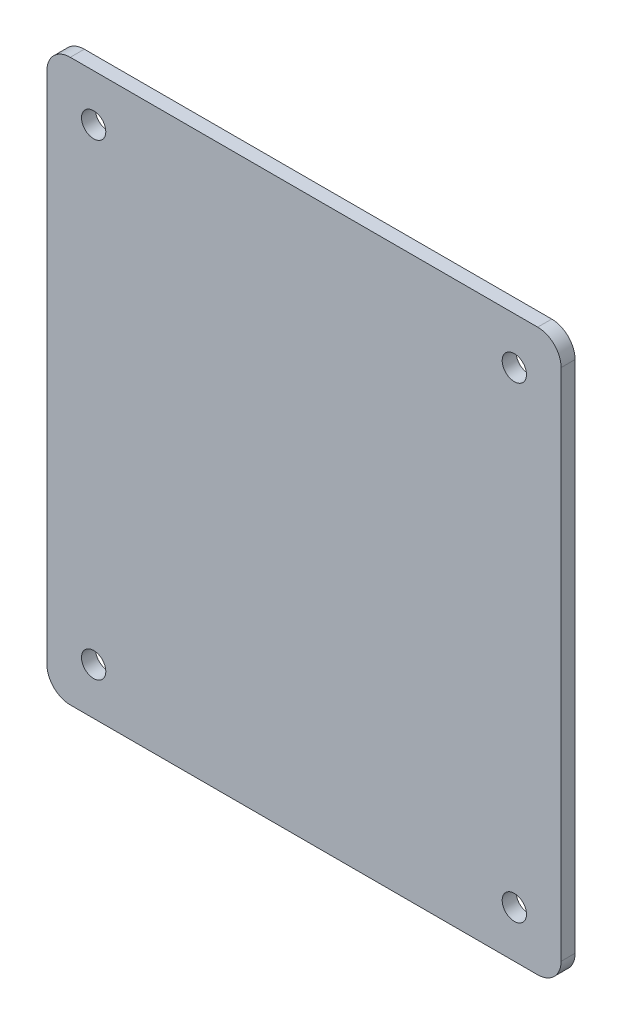
ISO-10303-21;
HEADER;
FILE_DESCRIPTION(('STEP AP214'),'2;1');
FILE_NAME('part.step','',(''),(''),'','','');
FILE_SCHEMA(('AUTOMOTIVE_DESIGN { 1 0 10303 214 1 1 1 1 }'));
ENDSEC;
DATA;
#1=APPLICATION_CONTEXT('core data for automotive mechanical design processes');
#2=APPLICATION_PROTOCOL_DEFINITION('international standard','automotive_design',2000,#1);
#3=PRODUCT_CONTEXT('',#1,'mechanical');
#4=PRODUCT('Part','Part','',(#3));
#5=PRODUCT_RELATED_PRODUCT_CATEGORY('part','',(#4));
#6=PRODUCT_DEFINITION_FORMATION('','',#4);
#7=PRODUCT_DEFINITION_CONTEXT('part definition',#1,'design');
#8=PRODUCT_DEFINITION('design','',#6,#7);
#9=PRODUCT_DEFINITION_SHAPE('','',#8);
#10=(LENGTH_UNIT() NAMED_UNIT(*) SI_UNIT(.MILLI.,.METRE.));
#11=(NAMED_UNIT(*) PLANE_ANGLE_UNIT() SI_UNIT($,.RADIAN.));
#12=(NAMED_UNIT(*) SI_UNIT($,.STERADIAN.) SOLID_ANGLE_UNIT());
#13=UNCERTAINTY_MEASURE_WITH_UNIT(LENGTH_MEASURE(1.E-05),#10,'distance_accuracy_value','');
#14=(GEOMETRIC_REPRESENTATION_CONTEXT(3) GLOBAL_UNCERTAINTY_ASSIGNED_CONTEXT((#13)) GLOBAL_UNIT_ASSIGNED_CONTEXT((#10,
#11,#12)) REPRESENTATION_CONTEXT('',''));
#15=CARTESIAN_POINT('',(0.,0.,0.));
#16=DIRECTION('',(0.,0.,1.));
#17=DIRECTION('',(1.,0.,0.));
#18=AXIS2_PLACEMENT_3D('',#15,#16,#17);
#19=CARTESIAN_POINT('',(0.,0.,3.));
#20=DIRECTION('',(0.,0.,1.));
#21=DIRECTION('',(1.,0.,0.));
#22=AXIS2_PLACEMENT_3D('',#19,#20,#21);
#23=PLANE('',#22);
#24=CARTESIAN_POINT('',(10.,-110.,3.));
#25=DIRECTION('',(0.,0.,1.));
#26=DIRECTION('',(1.,0.,0.));
#27=AXIS2_PLACEMENT_3D('',#24,#25,#26);
#28=CIRCLE('',#27,2.6);
#29=CARTESIAN_POINT('',(12.6,-110.,3.));
#30=VERTEX_POINT('',#29);
#31=EDGE_CURVE('E230',#30,#30,#28,.T.);
#32=ORIENTED_EDGE('',*,*,#31,.F.);
#33=EDGE_LOOP('',(#32));
#34=FACE_BOUND('',#33,.T.);
#35=CARTESIAN_POINT('',(10.,-10.,3.));
#36=DIRECTION('',(0.,0.,1.));
#37=DIRECTION('',(1.,0.,0.));
#38=AXIS2_PLACEMENT_3D('',#35,#36,#37);
#39=CIRCLE('',#38,2.6);
#40=CARTESIAN_POINT('',(12.6,-10.,3.));
#41=VERTEX_POINT('',#40);
#42=EDGE_CURVE('E152',#41,#41,#39,.T.);
#43=ORIENTED_EDGE('',*,*,#42,.F.);
#44=EDGE_LOOP('',(#43));
#45=FACE_BOUND('',#44,.T.);
#46=DIRECTION('',(0.,-1.,0.));
#47=VECTOR('',#46,1.);
#48=CARTESIAN_POINT('',(0.,0.,3.));
#49=LINE('',#48,#47);
#50=CARTESIAN_POINT('',(0.,-5.,3.));
#51=VERTEX_POINT('',#50);
#52=CARTESIAN_POINT('',(0.,-115.,3.));
#53=VERTEX_POINT('',#52);
#54=EDGE_CURVE('E158',#51,#53,#49,.T.);
#55=ORIENTED_EDGE('',*,*,#54,.T.);
#56=CARTESIAN_POINT('',(5.00000000000001,-115.,3.));
#57=DIRECTION('',(0.,0.,1.));
#58=DIRECTION('',(1.,0.,0.));
#59=AXIS2_PLACEMENT_3D('',#56,#57,#58);
#60=CIRCLE('',#59,5.);
#61=CARTESIAN_POINT('',(5.00000000000001,-120.,3.));
#62=VERTEX_POINT('',#61);
#63=EDGE_CURVE('E181',#53,#62,#60,.T.);
#64=ORIENTED_EDGE('',*,*,#63,.T.);
#65=DIRECTION('',(1.,0.,0.));
#66=VECTOR('',#65,1.);
#67=CARTESIAN_POINT('',(0.,-120.,3.));
#68=LINE('',#67,#66);
#69=CARTESIAN_POINT('',(105.,-120.,3.));
#70=VERTEX_POINT('',#69);
#71=EDGE_CURVE('E134',#62,#70,#68,.T.);
#72=ORIENTED_EDGE('',*,*,#71,.T.);
#73=CARTESIAN_POINT('',(105.,-115.,3.));
#74=DIRECTION('',(0.,0.,1.));
#75=DIRECTION('',(1.,0.,0.));
#76=AXIS2_PLACEMENT_3D('',#73,#74,#75);
#77=CIRCLE('',#76,5.);
#78=CARTESIAN_POINT('',(110.,-115.,3.));
#79=VERTEX_POINT('',#78);
#80=EDGE_CURVE('E175',#70,#79,#77,.T.);
#81=ORIENTED_EDGE('',*,*,#80,.T.);
#82=DIRECTION('',(0.,1.,0.));
#83=VECTOR('',#82,1.);
#84=CARTESIAN_POINT('',(110.,0.,3.));
#85=LINE('',#84,#83);
#86=CARTESIAN_POINT('',(110.,-5.,3.));
#87=VERTEX_POINT('',#86);
#88=EDGE_CURVE('E194',#79,#87,#85,.T.);
#89=ORIENTED_EDGE('',*,*,#88,.T.);
#90=CARTESIAN_POINT('',(105.,-5.,3.));
#91=DIRECTION('',(0.,0.,1.));
#92=DIRECTION('',(1.,0.,0.));
#93=AXIS2_PLACEMENT_3D('',#90,#91,#92);
#94=CIRCLE('',#93,5.);
#95=CARTESIAN_POINT('',(105.,0.,3.));
#96=VERTEX_POINT('',#95);
#97=EDGE_CURVE('E68',#87,#96,#94,.T.);
#98=ORIENTED_EDGE('',*,*,#97,.T.);
#99=DIRECTION('',(-1.,0.,0.));
#100=VECTOR('',#99,1.);
#101=CARTESIAN_POINT('',(0.,0.,3.));
#102=LINE('',#101,#100);
#103=CARTESIAN_POINT('',(5.,0.,3.));
#104=VERTEX_POINT('',#103);
#105=EDGE_CURVE('E160',#96,#104,#102,.T.);
#106=ORIENTED_EDGE('',*,*,#105,.T.);
#107=CARTESIAN_POINT('',(5.,-5.,3.));
#108=DIRECTION('',(0.,0.,1.));
#109=DIRECTION('',(1.,0.,0.));
#110=AXIS2_PLACEMENT_3D('',#107,#108,#109);
#111=CIRCLE('',#110,5.);
#112=EDGE_CURVE('E178',#104,#51,#111,.T.);
#113=ORIENTED_EDGE('',*,*,#112,.T.);
#114=EDGE_LOOP('',(#55,#64,#72,#81,#89,#98,#106,#113));
#115=FACE_BOUND('',#114,.T.);
#116=CARTESIAN_POINT('',(100.,-10.,3.));
#117=DIRECTION('',(0.,0.,1.));
#118=DIRECTION('',(1.,0.,0.));
#119=AXIS2_PLACEMENT_3D('',#116,#117,#118);
#120=CIRCLE('',#119,2.6);
#121=CARTESIAN_POINT('',(102.6,-10.,3.));
#122=VERTEX_POINT('',#121);
#123=EDGE_CURVE('E222',#122,#122,#120,.T.);
#124=ORIENTED_EDGE('',*,*,#123,.F.);
#125=EDGE_LOOP('',(#124));
#126=FACE_BOUND('',#125,.T.);
#127=CARTESIAN_POINT('',(100.,-110.,3.));
#128=DIRECTION('',(0.,0.,1.));
#129=DIRECTION('',(1.,0.,0.));
#130=AXIS2_PLACEMENT_3D('',#127,#128,#129);
#131=CIRCLE('',#130,2.6);
#132=CARTESIAN_POINT('',(102.6,-110.,3.));
#133=VERTEX_POINT('',#132);
#134=EDGE_CURVE('E238',#133,#133,#131,.T.);
#135=ORIENTED_EDGE('',*,*,#134,.F.);
#136=EDGE_LOOP('',(#135));
#137=FACE_BOUND('',#136,.T.);
#138=ADVANCED_FACE('F45',(#34,#45,#115,#126,#137),#23,.T.);
#139=CARTESIAN_POINT('',(0.,0.,0.));
#140=DIRECTION('',(0.,0.,1.));
#141=DIRECTION('',(1.,0.,0.));
#142=AXIS2_PLACEMENT_3D('',#139,#140,#141);
#143=PLANE('',#142);
#144=DIRECTION('',(1.,0.,0.));
#145=VECTOR('',#144,1.);
#146=CARTESIAN_POINT('',(0.,-120.,0.));
#147=LINE('',#146,#145);
#148=CARTESIAN_POINT('',(5.00000000000001,-120.,0.));
#149=VERTEX_POINT('',#148);
#150=CARTESIAN_POINT('',(105.,-120.,0.));
#151=VERTEX_POINT('',#150);
#152=EDGE_CURVE('E131',#149,#151,#147,.T.);
#153=ORIENTED_EDGE('',*,*,#152,.F.);
#154=CARTESIAN_POINT('',(5.00000000000001,-115.,0.));
#155=DIRECTION('',(0.,0.,1.));
#156=DIRECTION('',(1.,0.,0.));
#157=AXIS2_PLACEMENT_3D('',#154,#155,#156);
#158=CIRCLE('',#157,5.);
#159=CARTESIAN_POINT('',(0.,-115.,0.));
#160=VERTEX_POINT('',#159);
#161=EDGE_CURVE('E113',#149,#160,#158,.F.);
#162=ORIENTED_EDGE('',*,*,#161,.T.);
#163=DIRECTION('',(0.,-1.,0.));
#164=VECTOR('',#163,1.);
#165=CARTESIAN_POINT('',(0.,0.,0.));
#166=LINE('',#165,#164);
#167=CARTESIAN_POINT('',(0.,-5.,0.));
#168=VERTEX_POINT('',#167);
#169=EDGE_CURVE('E145',#168,#160,#166,.T.);
#170=ORIENTED_EDGE('',*,*,#169,.F.);
#171=CARTESIAN_POINT('',(5.,-5.,0.));
#172=DIRECTION('',(0.,0.,1.));
#173=DIRECTION('',(1.,0.,0.));
#174=AXIS2_PLACEMENT_3D('',#171,#172,#173);
#175=CIRCLE('',#174,5.);
#176=CARTESIAN_POINT('',(5.,0.,0.));
#177=VERTEX_POINT('',#176);
#178=EDGE_CURVE('E125',#168,#177,#175,.F.);
#179=ORIENTED_EDGE('',*,*,#178,.T.);
#180=DIRECTION('',(-1.,0.,0.));
#181=VECTOR('',#180,1.);
#182=CARTESIAN_POINT('',(0.,0.,0.));
#183=LINE('',#182,#181);
#184=CARTESIAN_POINT('',(105.,0.,0.));
#185=VERTEX_POINT('',#184);
#186=EDGE_CURVE('E150',#185,#177,#183,.T.);
#187=ORIENTED_EDGE('',*,*,#186,.F.);
#188=CARTESIAN_POINT('',(105.,-5.,0.));
#189=DIRECTION('',(0.,0.,1.));
#190=DIRECTION('',(1.,0.,0.));
#191=AXIS2_PLACEMENT_3D('',#188,#189,#190);
#192=CIRCLE('',#191,5.);
#193=CARTESIAN_POINT('',(110.,-5.,0.));
#194=VERTEX_POINT('',#193);
#195=EDGE_CURVE('E136',#185,#194,#192,.F.);
#196=ORIENTED_EDGE('',*,*,#195,.T.);
#197=DIRECTION('',(0.,1.,0.));
#198=VECTOR('',#197,1.);
#199=CARTESIAN_POINT('',(110.,0.,0.));
#200=LINE('',#199,#198);
#201=CARTESIAN_POINT('',(110.,-115.,0.));
#202=VERTEX_POINT('',#201);
#203=EDGE_CURVE('E144',#202,#194,#200,.T.);
#204=ORIENTED_EDGE('',*,*,#203,.F.);
#205=CARTESIAN_POINT('',(105.,-115.,0.));
#206=DIRECTION('',(0.,0.,1.));
#207=DIRECTION('',(1.,0.,0.));
#208=AXIS2_PLACEMENT_3D('',#205,#206,#207);
#209=CIRCLE('',#208,5.);
#210=EDGE_CURVE('E142',#202,#151,#209,.F.);
#211=ORIENTED_EDGE('',*,*,#210,.T.);
#212=EDGE_LOOP('',(#153,#162,#170,#179,#187,#196,#204,#211));
#213=FACE_BOUND('',#212,.T.);
#214=CARTESIAN_POINT('',(10.,-10.,0.));
#215=DIRECTION('',(0.,0.,1.));
#216=DIRECTION('',(1.,0.,0.));
#217=AXIS2_PLACEMENT_3D('',#214,#215,#216);
#218=CIRCLE('',#217,2.6);
#219=CARTESIAN_POINT('',(12.6,-10.,0.));
#220=VERTEX_POINT('',#219);
#221=EDGE_CURVE('E217',#220,#220,#218,.T.);
#222=ORIENTED_EDGE('',*,*,#221,.T.);
#223=EDGE_LOOP('',(#222));
#224=FACE_BOUND('',#223,.T.);
#225=CARTESIAN_POINT('',(100.,-10.,0.));
#226=DIRECTION('',(0.,0.,1.));
#227=DIRECTION('',(1.,0.,0.));
#228=AXIS2_PLACEMENT_3D('',#225,#226,#227);
#229=CIRCLE('',#228,2.6);
#230=CARTESIAN_POINT('',(102.6,-10.,0.));
#231=VERTEX_POINT('',#230);
#232=EDGE_CURVE('E226',#231,#231,#229,.T.);
#233=ORIENTED_EDGE('',*,*,#232,.T.);
#234=EDGE_LOOP('',(#233));
#235=FACE_BOUND('',#234,.T.);
#236=CARTESIAN_POINT('',(10.,-110.,0.));
#237=DIRECTION('',(0.,0.,1.));
#238=DIRECTION('',(1.,0.,0.));
#239=AXIS2_PLACEMENT_3D('',#236,#237,#238);
#240=CIRCLE('',#239,2.6);
#241=CARTESIAN_POINT('',(12.6,-110.,0.));
#242=VERTEX_POINT('',#241);
#243=EDGE_CURVE('E234',#242,#242,#240,.T.);
#244=ORIENTED_EDGE('',*,*,#243,.T.);
#245=EDGE_LOOP('',(#244));
#246=FACE_BOUND('',#245,.T.);
#247=CARTESIAN_POINT('',(100.,-110.,0.));
#248=DIRECTION('',(0.,0.,1.));
#249=DIRECTION('',(1.,0.,0.));
#250=AXIS2_PLACEMENT_3D('',#247,#248,#249);
#251=CIRCLE('',#250,2.6);
#252=CARTESIAN_POINT('',(102.6,-110.,0.));
#253=VERTEX_POINT('',#252);
#254=EDGE_CURVE('E242',#253,#253,#251,.T.);
#255=ORIENTED_EDGE('',*,*,#254,.T.);
#256=EDGE_LOOP('',(#255));
#257=FACE_BOUND('',#256,.T.);
#258=ADVANCED_FACE('F139',(#213,#224,#235,#246,#257),#143,.F.);
#259=CARTESIAN_POINT('',(0.,0.,3.));
#260=DIRECTION('',(1.,0.,0.));
#261=DIRECTION('',(0.,1.,0.));
#262=AXIS2_PLACEMENT_3D('',#259,#260,#261);
#263=PLANE('',#262);
#264=ORIENTED_EDGE('',*,*,#169,.T.);
#265=DIRECTION('',(0.,0.,-1.));
#266=VECTOR('',#265,1.);
#267=CARTESIAN_POINT('',(0.,-115.,3.));
#268=LINE('',#267,#266);
#269=EDGE_CURVE('E118',#160,#53,#268,.F.);
#270=ORIENTED_EDGE('',*,*,#269,.T.);
#271=ORIENTED_EDGE('',*,*,#54,.F.);
#272=DIRECTION('',(0.,0.,-1.));
#273=VECTOR('',#272,1.);
#274=CARTESIAN_POINT('',(0.,-5.,3.));
#275=LINE('',#274,#273);
#276=EDGE_CURVE('E124',#51,#168,#275,.T.);
#277=ORIENTED_EDGE('',*,*,#276,.T.);
#278=EDGE_LOOP('',(#264,#270,#271,#277));
#279=FACE_BOUND('',#278,.T.);
#280=ADVANCED_FACE('F211',(#279),#263,.F.);
#281=CARTESIAN_POINT('',(0.,-120.,3.));
#282=DIRECTION('',(0.,1.,0.));
#283=DIRECTION('',(0.,0.,1.));
#284=AXIS2_PLACEMENT_3D('',#281,#282,#283);
#285=PLANE('',#284);
#286=ORIENTED_EDGE('',*,*,#71,.F.);
#287=DIRECTION('',(0.,0.,-1.));
#288=VECTOR('',#287,1.);
#289=CARTESIAN_POINT('',(5.00000000000001,-120.,3.));
#290=LINE('',#289,#288);
#291=EDGE_CURVE('E117',#62,#149,#290,.T.);
#292=ORIENTED_EDGE('',*,*,#291,.T.);
#293=ORIENTED_EDGE('',*,*,#152,.T.);
#294=DIRECTION('',(0.,0.,-1.));
#295=VECTOR('',#294,1.);
#296=CARTESIAN_POINT('',(105.,-120.,3.));
#297=LINE('',#296,#295);
#298=EDGE_CURVE('E137',#151,#70,#297,.F.);
#299=ORIENTED_EDGE('',*,*,#298,.T.);
#300=EDGE_LOOP('',(#286,#292,#293,#299));
#301=FACE_BOUND('',#300,.T.);
#302=ADVANCED_FACE('F130',(#301),#285,.F.);
#303=CARTESIAN_POINT('',(110.,0.,3.));
#304=DIRECTION('',(-1.,0.,0.));
#305=DIRECTION('',(0.,-1.,0.));
#306=AXIS2_PLACEMENT_3D('',#303,#304,#305);
#307=PLANE('',#306);
#308=ORIENTED_EDGE('',*,*,#88,.F.);
#309=DIRECTION('',(0.,0.,-1.));
#310=VECTOR('',#309,1.);
#311=CARTESIAN_POINT('',(110.,-115.,3.));
#312=LINE('',#311,#310);
#313=EDGE_CURVE('E11',#79,#202,#312,.T.);
#314=ORIENTED_EDGE('',*,*,#313,.T.);
#315=ORIENTED_EDGE('',*,*,#203,.T.);
#316=DIRECTION('',(0.,0.,-1.));
#317=VECTOR('',#316,1.);
#318=CARTESIAN_POINT('',(110.,-5.,3.));
#319=LINE('',#318,#317);
#320=EDGE_CURVE('E54',#194,#87,#319,.F.);
#321=ORIENTED_EDGE('',*,*,#320,.T.);
#322=EDGE_LOOP('',(#308,#314,#315,#321));
#323=FACE_BOUND('',#322,.T.);
#324=ADVANCED_FACE('F193',(#323),#307,.F.);
#325=CARTESIAN_POINT('',(0.,0.,3.));
#326=DIRECTION('',(0.,-1.,0.));
#327=DIRECTION('',(0.,0.,-1.));
#328=AXIS2_PLACEMENT_3D('',#325,#326,#327);
#329=PLANE('',#328);
#330=ORIENTED_EDGE('',*,*,#186,.T.);
#331=DIRECTION('',(0.,0.,-1.));
#332=VECTOR('',#331,1.);
#333=CARTESIAN_POINT('',(5.,0.,3.));
#334=LINE('',#333,#332);
#335=EDGE_CURVE('E61',#177,#104,#334,.F.);
#336=ORIENTED_EDGE('',*,*,#335,.T.);
#337=ORIENTED_EDGE('',*,*,#105,.F.);
#338=DIRECTION('',(0.,0.,-1.));
#339=VECTOR('',#338,1.);
#340=CARTESIAN_POINT('',(105.,0.,3.));
#341=LINE('',#340,#339);
#342=EDGE_CURVE('E184',#96,#185,#341,.T.);
#343=ORIENTED_EDGE('',*,*,#342,.T.);
#344=EDGE_LOOP('',(#330,#336,#337,#343));
#345=FACE_BOUND('',#344,.T.);
#346=ADVANCED_FACE('F204',(#345),#329,.F.);
#347=CARTESIAN_POINT('',(10.,-10.,3.));
#348=DIRECTION('',(0.,0.,-1.));
#349=DIRECTION('',(-1.,0.,0.));
#350=AXIS2_PLACEMENT_3D('',#347,#348,#349);
#351=CYLINDRICAL_SURFACE('',#350,2.6);
#352=ORIENTED_EDGE('',*,*,#42,.T.);
#353=EDGE_LOOP('',(#352));
#354=FACE_BOUND('',#353,.T.);
#355=ORIENTED_EDGE('',*,*,#221,.F.);
#356=EDGE_LOOP('',(#355));
#357=FACE_BOUND('',#356,.T.);
#358=ADVANCED_FACE('F264',(#354,#357),#351,.F.);
#359=CARTESIAN_POINT('',(100.,-10.,3.));
#360=DIRECTION('',(0.,0.,-1.));
#361=DIRECTION('',(-1.,0.,0.));
#362=AXIS2_PLACEMENT_3D('',#359,#360,#361);
#363=CYLINDRICAL_SURFACE('',#362,2.6);
#364=ORIENTED_EDGE('',*,*,#123,.T.);
#365=EDGE_LOOP('',(#364));
#366=FACE_BOUND('',#365,.T.);
#367=ORIENTED_EDGE('',*,*,#232,.F.);
#368=EDGE_LOOP('',(#367));
#369=FACE_BOUND('',#368,.T.);
#370=ADVANCED_FACE('F320',(#366,#369),#363,.F.);
#371=CARTESIAN_POINT('',(10.,-110.,3.));
#372=DIRECTION('',(0.,0.,-1.));
#373=DIRECTION('',(-1.,0.,0.));
#374=AXIS2_PLACEMENT_3D('',#371,#372,#373);
#375=CYLINDRICAL_SURFACE('',#374,2.6);
#376=ORIENTED_EDGE('',*,*,#31,.T.);
#377=EDGE_LOOP('',(#376));
#378=FACE_BOUND('',#377,.T.);
#379=ORIENTED_EDGE('',*,*,#243,.F.);
#380=EDGE_LOOP('',(#379));
#381=FACE_BOUND('',#380,.T.);
#382=ADVANCED_FACE('F311',(#378,#381),#375,.F.);
#383=CARTESIAN_POINT('',(100.,-110.,3.));
#384=DIRECTION('',(0.,0.,-1.));
#385=DIRECTION('',(-1.,0.,0.));
#386=AXIS2_PLACEMENT_3D('',#383,#384,#385);
#387=CYLINDRICAL_SURFACE('',#386,2.6);
#388=ORIENTED_EDGE('',*,*,#134,.T.);
#389=EDGE_LOOP('',(#388));
#390=FACE_BOUND('',#389,.T.);
#391=ORIENTED_EDGE('',*,*,#254,.F.);
#392=EDGE_LOOP('',(#391));
#393=FACE_BOUND('',#392,.T.);
#394=ADVANCED_FACE('F250',(#390,#393),#387,.F.);
#395=CARTESIAN_POINT('',(5.00000000000001,-115.,3.));
#396=DIRECTION('',(0.,0.,-1.));
#397=DIRECTION('',(-1.,0.,0.));
#398=AXIS2_PLACEMENT_3D('',#395,#396,#397);
#399=CYLINDRICAL_SURFACE('',#398,5.);
#400=ORIENTED_EDGE('',*,*,#63,.F.);
#401=ORIENTED_EDGE('',*,*,#269,.F.);
#402=ORIENTED_EDGE('',*,*,#161,.F.);
#403=ORIENTED_EDGE('',*,*,#291,.F.);
#404=EDGE_LOOP('',(#400,#401,#402,#403));
#405=FACE_BOUND('',#404,.T.);
#406=ADVANCED_FACE('F116',(#405),#399,.T.);
#407=CARTESIAN_POINT('',(5.,-5.,3.));
#408=DIRECTION('',(0.,0.,-1.));
#409=DIRECTION('',(-1.,0.,0.));
#410=AXIS2_PLACEMENT_3D('',#407,#408,#409);
#411=CYLINDRICAL_SURFACE('',#410,5.);
#412=ORIENTED_EDGE('',*,*,#112,.F.);
#413=ORIENTED_EDGE('',*,*,#335,.F.);
#414=ORIENTED_EDGE('',*,*,#178,.F.);
#415=ORIENTED_EDGE('',*,*,#276,.F.);
#416=EDGE_LOOP('',(#412,#413,#414,#415));
#417=FACE_BOUND('',#416,.T.);
#418=ADVANCED_FACE('F208',(#417),#411,.T.);
#419=CARTESIAN_POINT('',(105.,-115.,3.));
#420=DIRECTION('',(0.,0.,-1.));
#421=DIRECTION('',(-1.,0.,0.));
#422=AXIS2_PLACEMENT_3D('',#419,#420,#421);
#423=CYLINDRICAL_SURFACE('',#422,5.);
#424=ORIENTED_EDGE('',*,*,#80,.F.);
#425=ORIENTED_EDGE('',*,*,#298,.F.);
#426=ORIENTED_EDGE('',*,*,#210,.F.);
#427=ORIENTED_EDGE('',*,*,#313,.F.);
#428=EDGE_LOOP('',(#424,#425,#426,#427));
#429=FACE_BOUND('',#428,.T.);
#430=ADVANCED_FACE('F278',(#429),#423,.T.);
#431=CARTESIAN_POINT('',(105.,-5.,3.));
#432=DIRECTION('',(0.,0.,-1.));
#433=DIRECTION('',(-1.,0.,0.));
#434=AXIS2_PLACEMENT_3D('',#431,#432,#433);
#435=CYLINDRICAL_SURFACE('',#434,5.);
#436=ORIENTED_EDGE('',*,*,#97,.F.);
#437=ORIENTED_EDGE('',*,*,#320,.F.);
#438=ORIENTED_EDGE('',*,*,#195,.F.);
#439=ORIENTED_EDGE('',*,*,#342,.F.);
#440=EDGE_LOOP('',(#436,#437,#438,#439));
#441=FACE_BOUND('',#440,.T.);
#442=ADVANCED_FACE('F47',(#441),#435,.T.);
#443=CLOSED_SHELL('',(#138,#258,#280,#302,#324,#346,#358,#370,#382,#394,#406,#418,#430,#442));
#444=MANIFOLD_SOLID_BREP('B2',#443);
#445=ADVANCED_BREP_SHAPE_REPRESENTATION('',(#18,#444),#14);
#446=SHAPE_DEFINITION_REPRESENTATION(#9,#445);
ENDSEC;
END-ISO-10303-21;
